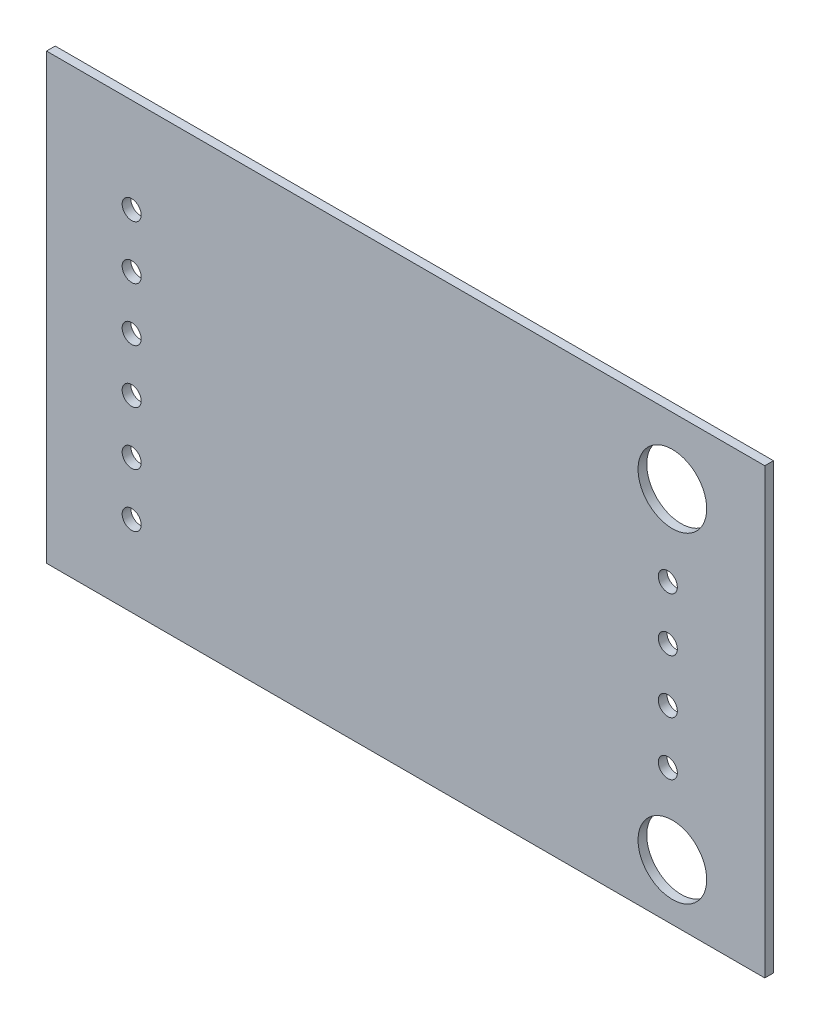
ISO-10303-21;
HEADER;
FILE_DESCRIPTION(('STEP AP214'),'2;1');
FILE_NAME('part.step','',(''),(''),'','','');
FILE_SCHEMA(('AUTOMOTIVE_DESIGN { 1 0 10303 214 1 1 1 1 }'));
ENDSEC;
DATA;
#1=APPLICATION_CONTEXT('core data for automotive mechanical design processes');
#2=APPLICATION_PROTOCOL_DEFINITION('international standard','automotive_design',2000,#1);
#3=PRODUCT_CONTEXT('',#1,'mechanical');
#4=PRODUCT('Part','Part','',(#3));
#5=PRODUCT_RELATED_PRODUCT_CATEGORY('part','',(#4));
#6=PRODUCT_DEFINITION_FORMATION('','',#4);
#7=PRODUCT_DEFINITION_CONTEXT('part definition',#1,'design');
#8=PRODUCT_DEFINITION('design','',#6,#7);
#9=PRODUCT_DEFINITION_SHAPE('','',#8);
#10=(LENGTH_UNIT() NAMED_UNIT(*) SI_UNIT(.MILLI.,.METRE.));
#11=(NAMED_UNIT(*) PLANE_ANGLE_UNIT() SI_UNIT($,.RADIAN.));
#12=(NAMED_UNIT(*) SI_UNIT($,.STERADIAN.) SOLID_ANGLE_UNIT());
#13=UNCERTAINTY_MEASURE_WITH_UNIT(LENGTH_MEASURE(1.E-05),#10,'distance_accuracy_value','');
#14=(GEOMETRIC_REPRESENTATION_CONTEXT(3) GLOBAL_UNCERTAINTY_ASSIGNED_CONTEXT((#13)) GLOBAL_UNIT_ASSIGNED_CONTEXT((#10,
#11,#12)) REPRESENTATION_CONTEXT('',''));
#15=CARTESIAN_POINT('',(0.,0.,0.));
#16=DIRECTION('',(0.,0.,1.));
#17=DIRECTION('',(1.,0.,0.));
#18=AXIS2_PLACEMENT_3D('',#15,#16,#17);
#19=CARTESIAN_POINT('',(1.26999999976454E-05,21.00001642,0.));
#20=DIRECTION('',(-1.,0.,0.));
#21=DIRECTION('',(0.,-1.,0.));
#22=AXIS2_PLACEMENT_3D('',#19,#20,#21);
#23=PLANE('',#22);
#24=DIRECTION('',(0.,-1.,0.));
#25=VECTOR('',#24,1.);
#26=CARTESIAN_POINT('',(1.26999999976454E-05,21.00001642,0.41148));
#27=LINE('',#26,#25);
#28=CARTESIAN_POINT('',(1.26999999976454E-05,21.00001642,0.41148));
#29=VERTEX_POINT('',#28);
#30=CARTESIAN_POINT('',(1.26999999992E-05,1.26999999994702E-05,0.41148));
#31=VERTEX_POINT('',#30);
#32=EDGE_CURVE('E108',#29,#31,#27,.T.);
#33=ORIENTED_EDGE('',*,*,#32,.F.);
#34=DIRECTION('',(0.,0.,1.));
#35=VECTOR('',#34,1.);
#36=CARTESIAN_POINT('',(1.26999999976454E-05,21.00001642,0.));
#37=LINE('',#36,#35);
#38=CARTESIAN_POINT('',(1.26999999976454E-05,21.00001642,0.));
#39=VERTEX_POINT('',#38);
#40=EDGE_CURVE('E11',#39,#29,#37,.T.);
#41=ORIENTED_EDGE('',*,*,#40,.F.);
#42=DIRECTION('',(0.,-1.,0.));
#43=VECTOR('',#42,1.);
#44=CARTESIAN_POINT('',(1.26999999976454E-05,21.00001642,0.));
#45=LINE('',#44,#43);
#46=CARTESIAN_POINT('',(1.26999999992E-05,1.26999999994702E-05,0.));
#47=VERTEX_POINT('',#46);
#48=EDGE_CURVE('E101',#39,#47,#45,.T.);
#49=ORIENTED_EDGE('',*,*,#48,.T.);
#50=DIRECTION('',(0.,0.,1.));
#51=VECTOR('',#50,1.);
#52=CARTESIAN_POINT('',(1.26999999992E-05,1.26999999994702E-05,0.));
#53=LINE('',#52,#51);
#54=EDGE_CURVE('E46',#47,#31,#53,.T.);
#55=ORIENTED_EDGE('',*,*,#54,.T.);
#56=EDGE_LOOP('',(#33,#41,#49,#55));
#57=FACE_BOUND('',#56,.T.);
#58=ADVANCED_FACE('F43',(#57),#23,.T.);
#59=CARTESIAN_POINT('',(34.00001582,21.00001642,0.));
#60=DIRECTION('',(0.,1.,0.));
#61=DIRECTION('',(0.,0.,1.));
#62=AXIS2_PLACEMENT_3D('',#59,#60,#61);
#63=PLANE('',#62);
#64=DIRECTION('',(-1.,0.,0.));
#65=VECTOR('',#64,1.);
#66=CARTESIAN_POINT('',(34.00001582,21.00001642,0.41148));
#67=LINE('',#66,#65);
#68=CARTESIAN_POINT('',(34.00001582,21.00001642,0.41148));
#69=VERTEX_POINT('',#68);
#70=EDGE_CURVE('E103',#69,#29,#67,.T.);
#71=ORIENTED_EDGE('',*,*,#70,.F.);
#72=DIRECTION('',(0.,0.,1.));
#73=VECTOR('',#72,1.);
#74=CARTESIAN_POINT('',(34.00001582,21.00001642,0.));
#75=LINE('',#74,#73);
#76=CARTESIAN_POINT('',(34.00001582,21.00001642,0.));
#77=VERTEX_POINT('',#76);
#78=EDGE_CURVE('E52',#77,#69,#75,.T.);
#79=ORIENTED_EDGE('',*,*,#78,.F.);
#80=DIRECTION('',(-1.,0.,0.));
#81=VECTOR('',#80,1.);
#82=CARTESIAN_POINT('',(34.00001582,21.00001642,0.));
#83=LINE('',#82,#81);
#84=EDGE_CURVE('E98',#77,#39,#83,.T.);
#85=ORIENTED_EDGE('',*,*,#84,.T.);
#86=ORIENTED_EDGE('',*,*,#40,.T.);
#87=EDGE_LOOP('',(#71,#79,#85,#86));
#88=FACE_BOUND('',#87,.T.);
#89=ADVANCED_FACE('F119',(#88),#63,.T.);
#90=CARTESIAN_POINT('',(34.00001582,1.26999999993801E-05,0.));
#91=DIRECTION('',(1.,0.,0.));
#92=DIRECTION('',(0.,0.,-1.));
#93=AXIS2_PLACEMENT_3D('',#90,#91,#92);
#94=PLANE('',#93);
#95=DIRECTION('',(0.,1.,0.));
#96=VECTOR('',#95,1.);
#97=CARTESIAN_POINT('',(34.00001582,1.26999999993801E-05,0.41148));
#98=LINE('',#97,#96);
#99=CARTESIAN_POINT('',(34.00001582,1.26999999993801E-05,0.41148));
#100=VERTEX_POINT('',#99);
#101=EDGE_CURVE('E93',#100,#69,#98,.T.);
#102=ORIENTED_EDGE('',*,*,#101,.F.);
#103=DIRECTION('',(0.,0.,1.));
#104=VECTOR('',#103,1.);
#105=CARTESIAN_POINT('',(34.00001582,1.26999999993801E-05,0.));
#106=LINE('',#105,#104);
#107=CARTESIAN_POINT('',(34.00001582,1.26999999993801E-05,0.));
#108=VERTEX_POINT('',#107);
#109=EDGE_CURVE('E88',#108,#100,#106,.T.);
#110=ORIENTED_EDGE('',*,*,#109,.F.);
#111=DIRECTION('',(0.,1.,0.));
#112=VECTOR('',#111,1.);
#113=CARTESIAN_POINT('',(34.00001582,1.26999999993801E-05,0.));
#114=LINE('',#113,#112);
#115=EDGE_CURVE('E91',#108,#77,#114,.T.);
#116=ORIENTED_EDGE('',*,*,#115,.T.);
#117=ORIENTED_EDGE('',*,*,#78,.T.);
#118=EDGE_LOOP('',(#102,#110,#116,#117));
#119=FACE_BOUND('',#118,.T.);
#120=ADVANCED_FACE('F90',(#119),#94,.T.);
#121=CARTESIAN_POINT('',(1.26999999992E-05,1.26999999994702E-05,0.));
#122=DIRECTION('',(0.,-1.,0.));
#123=DIRECTION('',(1.,0.,0.));
#124=AXIS2_PLACEMENT_3D('',#121,#122,#123);
#125=PLANE('',#124);
#126=DIRECTION('',(1.,0.,0.));
#127=VECTOR('',#126,1.);
#128=CARTESIAN_POINT('',(1.26999999992E-05,1.26999999994702E-05,0.41148));
#129=LINE('',#128,#127);
#130=EDGE_CURVE('E111',#31,#100,#129,.T.);
#131=ORIENTED_EDGE('',*,*,#130,.F.);
#132=ORIENTED_EDGE('',*,*,#54,.F.);
#133=DIRECTION('',(1.,0.,0.));
#134=VECTOR('',#133,1.);
#135=CARTESIAN_POINT('',(1.26999999992E-05,1.26999999994702E-05,0.));
#136=LINE('',#135,#134);
#137=EDGE_CURVE('E97',#47,#108,#136,.T.);
#138=ORIENTED_EDGE('',*,*,#137,.T.);
#139=ORIENTED_EDGE('',*,*,#109,.T.);
#140=EDGE_LOOP('',(#131,#132,#138,#139));
#141=FACE_BOUND('',#140,.T.);
#142=ADVANCED_FACE('F100',(#141),#125,.T.);
#143=CARTESIAN_POINT('',(0.,0.,0.));
#144=DIRECTION('',(0.,0.,1.));
#145=DIRECTION('',(1.,0.,0.));
#146=AXIS2_PLACEMENT_3D('',#143,#144,#145);
#147=PLANE('',#146);
#148=CARTESIAN_POINT('',(29.6250486426004,2.6582362187213,0.));
#149=DIRECTION('',(0.,0.,1.));
#150=DIRECTION('',(1.,0.,0.));
#151=AXIS2_PLACEMENT_3D('',#148,#149,#150);
#152=CIRCLE('',#151,1.62499999999999);
#153=CARTESIAN_POINT('',(31.2500486426004,2.6582362187213,0.));
#154=VERTEX_POINT('',#153);
#155=EDGE_CURVE('E193',#154,#154,#152,.T.);
#156=ORIENTED_EDGE('',*,*,#155,.T.);
#157=EDGE_LOOP('',(#156));
#158=FACE_BOUND('',#157,.T.);
#159=CARTESIAN_POINT('',(29.6250486426004,17.858037309221,0.));
#160=DIRECTION('',(0.,0.,1.));
#161=DIRECTION('',(1.,0.,0.));
#162=AXIS2_PLACEMENT_3D('',#159,#160,#161);
#163=CIRCLE('',#162,1.625);
#164=CARTESIAN_POINT('',(31.2500486426004,17.858037309221,0.));
#165=VERTEX_POINT('',#164);
#166=EDGE_CURVE('E201',#165,#165,#163,.T.);
#167=ORIENTED_EDGE('',*,*,#166,.T.);
#168=EDGE_LOOP('',(#167));
#169=FACE_BOUND('',#168,.T.);
#170=CARTESIAN_POINT('',(4.03071762183416,8.89547967678131,0.));
#171=DIRECTION('',(0.,0.,1.));
#172=DIRECTION('',(-1.,0.,0.));
#173=AXIS2_PLACEMENT_3D('',#170,#171,#172);
#174=CIRCLE('',#173,0.4499991);
#175=CARTESIAN_POINT('',(3.58071852183416,8.89547967678131,0.));
#176=VERTEX_POINT('',#175);
#177=EDGE_CURVE('E207',#176,#176,#174,.T.);
#178=ORIENTED_EDGE('',*,*,#177,.T.);
#179=EDGE_LOOP('',(#178));
#180=FACE_BOUND('',#179,.T.);
#181=CARTESIAN_POINT('',(4.03071762183416,6.35547967678131,0.));
#182=DIRECTION('',(0.,0.,1.));
#183=DIRECTION('',(-1.,0.,0.));
#184=AXIS2_PLACEMENT_3D('',#181,#182,#183);
#185=CIRCLE('',#184,0.4499991);
#186=CARTESIAN_POINT('',(3.58071852183416,6.35547967678131,0.));
#187=VERTEX_POINT('',#186);
#188=EDGE_CURVE('E213',#187,#187,#185,.T.);
#189=ORIENTED_EDGE('',*,*,#188,.T.);
#190=EDGE_LOOP('',(#189));
#191=FACE_BOUND('',#190,.T.);
#192=CARTESIAN_POINT('',(4.03071762183416,16.5154796767813,0.));
#193=DIRECTION('',(0.,0.,1.));
#194=DIRECTION('',(-1.,0.,0.));
#195=AXIS2_PLACEMENT_3D('',#192,#193,#194);
#196=CIRCLE('',#195,0.449999100000001);
#197=CARTESIAN_POINT('',(3.58071852183416,16.5154796767813,0.));
#198=VERTEX_POINT('',#197);
#199=EDGE_CURVE('E219',#198,#198,#196,.T.);
#200=ORIENTED_EDGE('',*,*,#199,.T.);
#201=EDGE_LOOP('',(#200));
#202=FACE_BOUND('',#201,.T.);
#203=CARTESIAN_POINT('',(4.03071762183416,11.4354796767813,0.));
#204=DIRECTION('',(0.,0.,1.));
#205=DIRECTION('',(-1.,0.,0.));
#206=AXIS2_PLACEMENT_3D('',#203,#204,#205);
#207=CIRCLE('',#206,0.4499991);
#208=CARTESIAN_POINT('',(3.58071852183416,11.4354796767813,0.));
#209=VERTEX_POINT('',#208);
#210=EDGE_CURVE('E225',#209,#209,#207,.T.);
#211=ORIENTED_EDGE('',*,*,#210,.T.);
#212=EDGE_LOOP('',(#211));
#213=FACE_BOUND('',#212,.T.);
#214=CARTESIAN_POINT('',(4.03071762183416,13.9754796767813,0.));
#215=DIRECTION('',(0.,0.,1.));
#216=DIRECTION('',(-1.,0.,0.));
#217=AXIS2_PLACEMENT_3D('',#214,#215,#216);
#218=CIRCLE('',#217,0.4499991);
#219=CARTESIAN_POINT('',(3.58071852183416,13.9754796767813,0.));
#220=VERTEX_POINT('',#219);
#221=EDGE_CURVE('E231',#220,#220,#218,.T.);
#222=ORIENTED_EDGE('',*,*,#221,.T.);
#223=EDGE_LOOP('',(#222));
#224=FACE_BOUND('',#223,.T.);
#225=CARTESIAN_POINT('',(4.03071762183416,3.81547967678131,0.));
#226=DIRECTION('',(0.,0.,1.));
#227=DIRECTION('',(-1.,0.,0.));
#228=AXIS2_PLACEMENT_3D('',#225,#226,#227);
#229=CIRCLE('',#228,0.4499991);
#230=CARTESIAN_POINT('',(3.58071852183416,3.81547967678131,0.));
#231=VERTEX_POINT('',#230);
#232=EDGE_CURVE('E237',#231,#231,#229,.T.);
#233=ORIENTED_EDGE('',*,*,#232,.T.);
#234=EDGE_LOOP('',(#233));
#235=FACE_BOUND('',#234,.T.);
#236=CARTESIAN_POINT('',(29.409885994145,6.33181355797748,0.));
#237=DIRECTION('',(0.,0.,1.));
#238=DIRECTION('',(-1.,0.,0.));
#239=AXIS2_PLACEMENT_3D('',#236,#237,#238);
#240=CIRCLE('',#239,0.4499991);
#241=CARTESIAN_POINT('',(28.959886894145,6.33181355797748,0.));
#242=VERTEX_POINT('',#241);
#243=EDGE_CURVE('E243',#242,#242,#240,.T.);
#244=ORIENTED_EDGE('',*,*,#243,.T.);
#245=EDGE_LOOP('',(#244));
#246=FACE_BOUND('',#245,.T.);
#247=CARTESIAN_POINT('',(29.409885994145,13.9518135579775,0.));
#248=DIRECTION('',(0.,0.,1.));
#249=DIRECTION('',(-1.,0.,0.));
#250=AXIS2_PLACEMENT_3D('',#247,#248,#249);
#251=CIRCLE('',#250,0.4499991);
#252=CARTESIAN_POINT('',(28.959886894145,13.9518135579775,0.));
#253=VERTEX_POINT('',#252);
#254=EDGE_CURVE('E249',#253,#253,#251,.T.);
#255=ORIENTED_EDGE('',*,*,#254,.T.);
#256=EDGE_LOOP('',(#255));
#257=FACE_BOUND('',#256,.T.);
#258=CARTESIAN_POINT('',(29.409885994145,8.87181355797748,0.));
#259=DIRECTION('',(0.,0.,1.));
#260=DIRECTION('',(-1.,0.,0.));
#261=AXIS2_PLACEMENT_3D('',#258,#259,#260);
#262=CIRCLE('',#261,0.4499991);
#263=CARTESIAN_POINT('',(28.959886894145,8.87181355797748,0.));
#264=VERTEX_POINT('',#263);
#265=EDGE_CURVE('E255',#264,#264,#262,.T.);
#266=ORIENTED_EDGE('',*,*,#265,.T.);
#267=EDGE_LOOP('',(#266));
#268=FACE_BOUND('',#267,.T.);
#269=CARTESIAN_POINT('',(29.409885994145,11.4118135579775,0.));
#270=DIRECTION('',(0.,0.,1.));
#271=DIRECTION('',(-1.,0.,0.));
#272=AXIS2_PLACEMENT_3D('',#269,#270,#271);
#273=CIRCLE('',#272,0.4499991);
#274=CARTESIAN_POINT('',(28.959886894145,11.4118135579775,0.));
#275=VERTEX_POINT('',#274);
#276=EDGE_CURVE('E112',#275,#275,#273,.T.);
#277=ORIENTED_EDGE('',*,*,#276,.T.);
#278=EDGE_LOOP('',(#277));
#279=FACE_BOUND('',#278,.T.);
#280=ORIENTED_EDGE('',*,*,#48,.F.);
#281=ORIENTED_EDGE('',*,*,#84,.F.);
#282=ORIENTED_EDGE('',*,*,#115,.F.);
#283=ORIENTED_EDGE('',*,*,#137,.F.);
#284=EDGE_LOOP('',(#280,#281,#282,#283));
#285=FACE_BOUND('',#284,.T.);
#286=ADVANCED_FACE('F96',(#158,#169,#180,#191,#202,#213,#224,#235,#246,#257,#268,#279,#285),
#147,.F.);
#287=CARTESIAN_POINT('',(0.,0.,0.41148));
#288=DIRECTION('',(0.,0.,1.));
#289=DIRECTION('',(1.,0.,0.));
#290=AXIS2_PLACEMENT_3D('',#287,#288,#289);
#291=PLANE('',#290);
#292=CARTESIAN_POINT('',(29.6250486426004,2.6582362187213,0.41148));
#293=DIRECTION('',(0.,0.,1.));
#294=DIRECTION('',(1.,0.,0.));
#295=AXIS2_PLACEMENT_3D('',#292,#293,#294);
#296=CIRCLE('',#295,1.62499999999999);
#297=CARTESIAN_POINT('',(31.2500486426004,2.6582362187213,0.41148));
#298=VERTEX_POINT('',#297);
#299=EDGE_CURVE('E196',#298,#298,#296,.T.);
#300=ORIENTED_EDGE('',*,*,#299,.F.);
#301=EDGE_LOOP('',(#300));
#302=FACE_BOUND('',#301,.T.);
#303=CARTESIAN_POINT('',(29.6250486426004,17.858037309221,0.41148));
#304=DIRECTION('',(0.,0.,1.));
#305=DIRECTION('',(1.,0.,0.));
#306=AXIS2_PLACEMENT_3D('',#303,#304,#305);
#307=CIRCLE('',#306,1.625);
#308=CARTESIAN_POINT('',(31.2500486426004,17.858037309221,0.41148));
#309=VERTEX_POINT('',#308);
#310=EDGE_CURVE('E198',#309,#309,#307,.T.);
#311=ORIENTED_EDGE('',*,*,#310,.F.);
#312=EDGE_LOOP('',(#311));
#313=FACE_BOUND('',#312,.T.);
#314=CARTESIAN_POINT('',(4.03071762183416,8.89547967678131,0.41148));
#315=DIRECTION('',(0.,0.,1.));
#316=DIRECTION('',(-1.,0.,0.));
#317=AXIS2_PLACEMENT_3D('',#314,#315,#316);
#318=CIRCLE('',#317,0.4499991);
#319=CARTESIAN_POINT('',(3.58071852183416,8.89547967678131,0.41148));
#320=VERTEX_POINT('',#319);
#321=EDGE_CURVE('E204',#320,#320,#318,.T.);
#322=ORIENTED_EDGE('',*,*,#321,.F.);
#323=EDGE_LOOP('',(#322));
#324=FACE_BOUND('',#323,.T.);
#325=CARTESIAN_POINT('',(4.03071762183416,6.35547967678131,0.41148));
#326=DIRECTION('',(0.,0.,1.));
#327=DIRECTION('',(-1.,0.,0.));
#328=AXIS2_PLACEMENT_3D('',#325,#326,#327);
#329=CIRCLE('',#328,0.4499991);
#330=CARTESIAN_POINT('',(3.58071852183416,6.35547967678131,0.41148));
#331=VERTEX_POINT('',#330);
#332=EDGE_CURVE('E210',#331,#331,#329,.T.);
#333=ORIENTED_EDGE('',*,*,#332,.F.);
#334=EDGE_LOOP('',(#333));
#335=FACE_BOUND('',#334,.T.);
#336=CARTESIAN_POINT('',(4.03071762183416,16.5154796767813,0.41148));
#337=DIRECTION('',(0.,0.,1.));
#338=DIRECTION('',(-1.,0.,0.));
#339=AXIS2_PLACEMENT_3D('',#336,#337,#338);
#340=CIRCLE('',#339,0.449999100000001);
#341=CARTESIAN_POINT('',(3.58071852183416,16.5154796767813,0.41148));
#342=VERTEX_POINT('',#341);
#343=EDGE_CURVE('E216',#342,#342,#340,.T.);
#344=ORIENTED_EDGE('',*,*,#343,.F.);
#345=EDGE_LOOP('',(#344));
#346=FACE_BOUND('',#345,.T.);
#347=CARTESIAN_POINT('',(4.03071762183416,11.4354796767813,0.41148));
#348=DIRECTION('',(0.,0.,1.));
#349=DIRECTION('',(-1.,0.,0.));
#350=AXIS2_PLACEMENT_3D('',#347,#348,#349);
#351=CIRCLE('',#350,0.4499991);
#352=CARTESIAN_POINT('',(3.58071852183416,11.4354796767813,0.41148));
#353=VERTEX_POINT('',#352);
#354=EDGE_CURVE('E222',#353,#353,#351,.T.);
#355=ORIENTED_EDGE('',*,*,#354,.F.);
#356=EDGE_LOOP('',(#355));
#357=FACE_BOUND('',#356,.T.);
#358=CARTESIAN_POINT('',(4.03071762183416,13.9754796767813,0.41148));
#359=DIRECTION('',(0.,0.,1.));
#360=DIRECTION('',(-1.,0.,0.));
#361=AXIS2_PLACEMENT_3D('',#358,#359,#360);
#362=CIRCLE('',#361,0.4499991);
#363=CARTESIAN_POINT('',(3.58071852183416,13.9754796767813,0.41148));
#364=VERTEX_POINT('',#363);
#365=EDGE_CURVE('E228',#364,#364,#362,.T.);
#366=ORIENTED_EDGE('',*,*,#365,.F.);
#367=EDGE_LOOP('',(#366));
#368=FACE_BOUND('',#367,.T.);
#369=CARTESIAN_POINT('',(4.03071762183416,3.81547967678131,0.41148));
#370=DIRECTION('',(0.,0.,1.));
#371=DIRECTION('',(-1.,0.,0.));
#372=AXIS2_PLACEMENT_3D('',#369,#370,#371);
#373=CIRCLE('',#372,0.4499991);
#374=CARTESIAN_POINT('',(3.58071852183416,3.81547967678131,0.41148));
#375=VERTEX_POINT('',#374);
#376=EDGE_CURVE('E234',#375,#375,#373,.T.);
#377=ORIENTED_EDGE('',*,*,#376,.F.);
#378=EDGE_LOOP('',(#377));
#379=FACE_BOUND('',#378,.T.);
#380=CARTESIAN_POINT('',(29.409885994145,6.33181355797748,0.41148));
#381=DIRECTION('',(0.,0.,1.));
#382=DIRECTION('',(-1.,0.,0.));
#383=AXIS2_PLACEMENT_3D('',#380,#381,#382);
#384=CIRCLE('',#383,0.4499991);
#385=CARTESIAN_POINT('',(28.959886894145,6.33181355797748,0.41148));
#386=VERTEX_POINT('',#385);
#387=EDGE_CURVE('E240',#386,#386,#384,.T.);
#388=ORIENTED_EDGE('',*,*,#387,.F.);
#389=EDGE_LOOP('',(#388));
#390=FACE_BOUND('',#389,.T.);
#391=CARTESIAN_POINT('',(29.409885994145,13.9518135579775,0.41148));
#392=DIRECTION('',(0.,0.,1.));
#393=DIRECTION('',(-1.,0.,0.));
#394=AXIS2_PLACEMENT_3D('',#391,#392,#393);
#395=CIRCLE('',#394,0.4499991);
#396=CARTESIAN_POINT('',(28.959886894145,13.9518135579775,0.41148));
#397=VERTEX_POINT('',#396);
#398=EDGE_CURVE('E246',#397,#397,#395,.T.);
#399=ORIENTED_EDGE('',*,*,#398,.F.);
#400=EDGE_LOOP('',(#399));
#401=FACE_BOUND('',#400,.T.);
#402=CARTESIAN_POINT('',(29.409885994145,8.87181355797748,0.41148));
#403=DIRECTION('',(0.,0.,1.));
#404=DIRECTION('',(-1.,0.,0.));
#405=AXIS2_PLACEMENT_3D('',#402,#403,#404);
#406=CIRCLE('',#405,0.4499991);
#407=CARTESIAN_POINT('',(28.959886894145,8.87181355797748,0.41148));
#408=VERTEX_POINT('',#407);
#409=EDGE_CURVE('E252',#408,#408,#406,.T.);
#410=ORIENTED_EDGE('',*,*,#409,.F.);
#411=EDGE_LOOP('',(#410));
#412=FACE_BOUND('',#411,.T.);
#413=CARTESIAN_POINT('',(29.409885994145,11.4118135579775,0.41148));
#414=DIRECTION('',(0.,0.,1.));
#415=DIRECTION('',(-1.,0.,0.));
#416=AXIS2_PLACEMENT_3D('',#413,#414,#415);
#417=CIRCLE('',#416,0.4499991);
#418=CARTESIAN_POINT('',(28.959886894145,11.4118135579775,0.41148));
#419=VERTEX_POINT('',#418);
#420=EDGE_CURVE('E258',#419,#419,#417,.T.);
#421=ORIENTED_EDGE('',*,*,#420,.F.);
#422=EDGE_LOOP('',(#421));
#423=FACE_BOUND('',#422,.T.);
#424=ORIENTED_EDGE('',*,*,#32,.T.);
#425=ORIENTED_EDGE('',*,*,#130,.T.);
#426=ORIENTED_EDGE('',*,*,#101,.T.);
#427=ORIENTED_EDGE('',*,*,#70,.T.);
#428=EDGE_LOOP('',(#424,#425,#426,#427));
#429=FACE_BOUND('',#428,.T.);
#430=ADVANCED_FACE('F118',(#302,#313,#324,#335,#346,#357,#368,#379,#390,#401,#412,#423,#429),
#291,.T.);
#431=CARTESIAN_POINT('',(29.409885994145,11.4118135579775,0.));
#432=DIRECTION('',(0.,0.,1.));
#433=DIRECTION('',(1.,0.,0.));
#434=AXIS2_PLACEMENT_3D('',#431,#432,#433);
#435=CYLINDRICAL_SURFACE('',#434,0.4499991);
#436=ORIENTED_EDGE('',*,*,#276,.F.);
#437=EDGE_LOOP('',(#436));
#438=FACE_BOUND('',#437,.T.);
#439=ORIENTED_EDGE('',*,*,#420,.T.);
#440=EDGE_LOOP('',(#439));
#441=FACE_BOUND('',#440,.T.);
#442=ADVANCED_FACE('F140',(#438,#441),#435,.F.);
#443=CARTESIAN_POINT('',(29.409885994145,8.87181355797748,0.));
#444=DIRECTION('',(0.,0.,1.));
#445=DIRECTION('',(1.,0.,0.));
#446=AXIS2_PLACEMENT_3D('',#443,#444,#445);
#447=CYLINDRICAL_SURFACE('',#446,0.4499991);
#448=ORIENTED_EDGE('',*,*,#265,.F.);
#449=EDGE_LOOP('',(#448));
#450=FACE_BOUND('',#449,.T.);
#451=ORIENTED_EDGE('',*,*,#409,.T.);
#452=EDGE_LOOP('',(#451));
#453=FACE_BOUND('',#452,.T.);
#454=ADVANCED_FACE('F146',(#450,#453),#447,.F.);
#455=CARTESIAN_POINT('',(29.409885994145,13.9518135579775,0.));
#456=DIRECTION('',(0.,0.,1.));
#457=DIRECTION('',(1.,0.,0.));
#458=AXIS2_PLACEMENT_3D('',#455,#456,#457);
#459=CYLINDRICAL_SURFACE('',#458,0.4499991);
#460=ORIENTED_EDGE('',*,*,#254,.F.);
#461=EDGE_LOOP('',(#460));
#462=FACE_BOUND('',#461,.T.);
#463=ORIENTED_EDGE('',*,*,#398,.T.);
#464=EDGE_LOOP('',(#463));
#465=FACE_BOUND('',#464,.T.);
#466=ADVANCED_FACE('F150',(#462,#465),#459,.F.);
#467=CARTESIAN_POINT('',(29.409885994145,6.33181355797748,0.));
#468=DIRECTION('',(0.,0.,1.));
#469=DIRECTION('',(1.,0.,0.));
#470=AXIS2_PLACEMENT_3D('',#467,#468,#469);
#471=CYLINDRICAL_SURFACE('',#470,0.4499991);
#472=ORIENTED_EDGE('',*,*,#243,.F.);
#473=EDGE_LOOP('',(#472));
#474=FACE_BOUND('',#473,.T.);
#475=ORIENTED_EDGE('',*,*,#387,.T.);
#476=EDGE_LOOP('',(#475));
#477=FACE_BOUND('',#476,.T.);
#478=ADVANCED_FACE('F154',(#474,#477),#471,.F.);
#479=CARTESIAN_POINT('',(4.03071762183416,3.81547967678131,0.));
#480=DIRECTION('',(0.,0.,1.));
#481=DIRECTION('',(1.,0.,0.));
#482=AXIS2_PLACEMENT_3D('',#479,#480,#481);
#483=CYLINDRICAL_SURFACE('',#482,0.4499991);
#484=ORIENTED_EDGE('',*,*,#232,.F.);
#485=EDGE_LOOP('',(#484));
#486=FACE_BOUND('',#485,.T.);
#487=ORIENTED_EDGE('',*,*,#376,.T.);
#488=EDGE_LOOP('',(#487));
#489=FACE_BOUND('',#488,.T.);
#490=ADVANCED_FACE('F158',(#486,#489),#483,.F.);
#491=CARTESIAN_POINT('',(4.03071762183416,13.9754796767813,0.));
#492=DIRECTION('',(0.,0.,1.));
#493=DIRECTION('',(1.,0.,0.));
#494=AXIS2_PLACEMENT_3D('',#491,#492,#493);
#495=CYLINDRICAL_SURFACE('',#494,0.4499991);
#496=ORIENTED_EDGE('',*,*,#221,.F.);
#497=EDGE_LOOP('',(#496));
#498=FACE_BOUND('',#497,.T.);
#499=ORIENTED_EDGE('',*,*,#365,.T.);
#500=EDGE_LOOP('',(#499));
#501=FACE_BOUND('',#500,.T.);
#502=ADVANCED_FACE('F162',(#498,#501),#495,.F.);
#503=CARTESIAN_POINT('',(4.03071762183416,11.4354796767813,0.));
#504=DIRECTION('',(0.,0.,1.));
#505=DIRECTION('',(1.,0.,0.));
#506=AXIS2_PLACEMENT_3D('',#503,#504,#505);
#507=CYLINDRICAL_SURFACE('',#506,0.4499991);
#508=ORIENTED_EDGE('',*,*,#210,.F.);
#509=EDGE_LOOP('',(#508));
#510=FACE_BOUND('',#509,.T.);
#511=ORIENTED_EDGE('',*,*,#354,.T.);
#512=EDGE_LOOP('',(#511));
#513=FACE_BOUND('',#512,.T.);
#514=ADVANCED_FACE('F166',(#510,#513),#507,.F.);
#515=CARTESIAN_POINT('',(4.03071762183416,16.5154796767813,0.));
#516=DIRECTION('',(0.,0.,1.));
#517=DIRECTION('',(1.,0.,0.));
#518=AXIS2_PLACEMENT_3D('',#515,#516,#517);
#519=CYLINDRICAL_SURFACE('',#518,0.449999100000001);
#520=ORIENTED_EDGE('',*,*,#199,.F.);
#521=EDGE_LOOP('',(#520));
#522=FACE_BOUND('',#521,.T.);
#523=ORIENTED_EDGE('',*,*,#343,.T.);
#524=EDGE_LOOP('',(#523));
#525=FACE_BOUND('',#524,.T.);
#526=ADVANCED_FACE('F170',(#522,#525),#519,.F.);
#527=CARTESIAN_POINT('',(4.03071762183416,6.35547967678131,0.));
#528=DIRECTION('',(0.,0.,1.));
#529=DIRECTION('',(1.,0.,0.));
#530=AXIS2_PLACEMENT_3D('',#527,#528,#529);
#531=CYLINDRICAL_SURFACE('',#530,0.4499991);
#532=ORIENTED_EDGE('',*,*,#188,.F.);
#533=EDGE_LOOP('',(#532));
#534=FACE_BOUND('',#533,.T.);
#535=ORIENTED_EDGE('',*,*,#332,.T.);
#536=EDGE_LOOP('',(#535));
#537=FACE_BOUND('',#536,.T.);
#538=ADVANCED_FACE('F174',(#534,#537),#531,.F.);
#539=CARTESIAN_POINT('',(4.03071762183416,8.89547967678131,0.));
#540=DIRECTION('',(0.,0.,1.));
#541=DIRECTION('',(1.,0.,0.));
#542=AXIS2_PLACEMENT_3D('',#539,#540,#541);
#543=CYLINDRICAL_SURFACE('',#542,0.4499991);
#544=ORIENTED_EDGE('',*,*,#177,.F.);
#545=EDGE_LOOP('',(#544));
#546=FACE_BOUND('',#545,.T.);
#547=ORIENTED_EDGE('',*,*,#321,.T.);
#548=EDGE_LOOP('',(#547));
#549=FACE_BOUND('',#548,.T.);
#550=ADVANCED_FACE('F178',(#546,#549),#543,.F.);
#551=CARTESIAN_POINT('',(29.6250486426004,17.858037309221,0.));
#552=DIRECTION('',(0.,0.,1.));
#553=DIRECTION('',(1.,0.,0.));
#554=AXIS2_PLACEMENT_3D('',#551,#552,#553);
#555=CYLINDRICAL_SURFACE('',#554,1.625);
#556=ORIENTED_EDGE('',*,*,#166,.F.);
#557=EDGE_LOOP('',(#556));
#558=FACE_BOUND('',#557,.T.);
#559=ORIENTED_EDGE('',*,*,#310,.T.);
#560=EDGE_LOOP('',(#559));
#561=FACE_BOUND('',#560,.T.);
#562=ADVANCED_FACE('F181',(#558,#561),#555,.F.);
#563=CARTESIAN_POINT('',(29.6250486426004,2.6582362187213,0.));
#564=DIRECTION('',(0.,0.,1.));
#565=DIRECTION('',(1.,0.,0.));
#566=AXIS2_PLACEMENT_3D('',#563,#564,#565);
#567=CYLINDRICAL_SURFACE('',#566,1.62499999999999);
#568=ORIENTED_EDGE('',*,*,#155,.F.);
#569=EDGE_LOOP('',(#568));
#570=FACE_BOUND('',#569,.T.);
#571=ORIENTED_EDGE('',*,*,#299,.T.);
#572=EDGE_LOOP('',(#571));
#573=FACE_BOUND('',#572,.T.);
#574=ADVANCED_FACE('F185',(#570,#573),#567,.F.);
#575=CLOSED_SHELL('',(#58,#89,#120,#142,#286,#430,#442,#454,#466,#478,#490,#502,#514,#526,#538,
#550,#562,#574));
#576=MANIFOLD_SOLID_BREP('B2',#575);
#577=ADVANCED_BREP_SHAPE_REPRESENTATION('',(#18,#576),#14);
#578=SHAPE_DEFINITION_REPRESENTATION(#9,#577);
ENDSEC;
END-ISO-10303-21;
